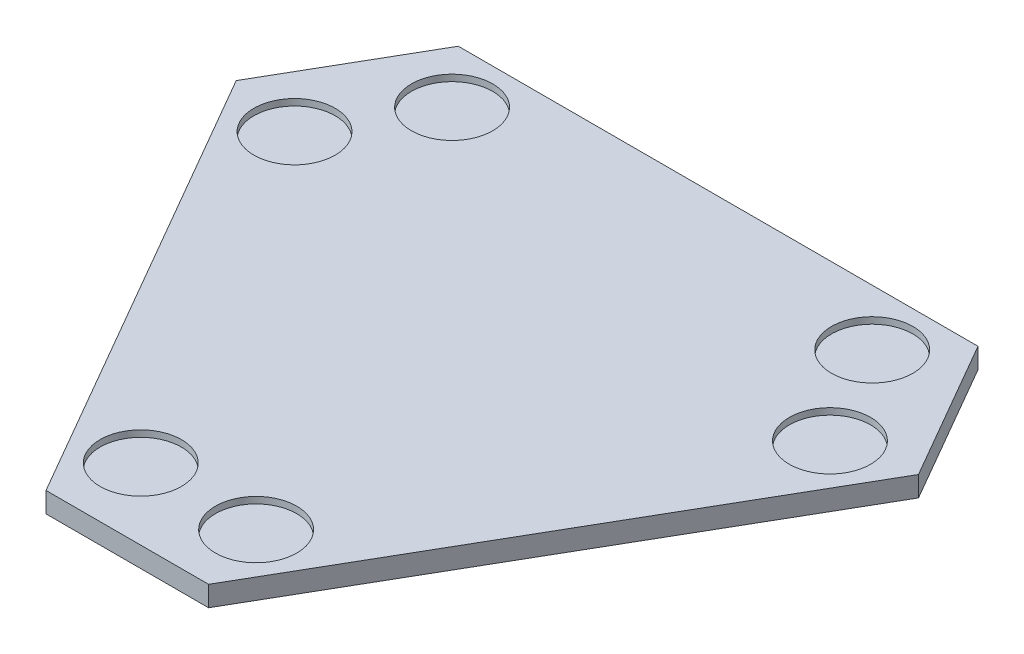
ISO-10303-21;
HEADER;
FILE_DESCRIPTION(('STEP AP214'),'2;1');
FILE_NAME('part.step','',(''),(''),'','','');
FILE_SCHEMA(('AUTOMOTIVE_DESIGN { 1 0 10303 214 1 1 1 1 }'));
ENDSEC;
DATA;
#1=APPLICATION_CONTEXT('core data for automotive mechanical design processes');
#2=APPLICATION_PROTOCOL_DEFINITION('international standard','automotive_design',2000,#1);
#3=PRODUCT_CONTEXT('',#1,'mechanical');
#4=PRODUCT('Part','Part','',(#3));
#5=PRODUCT_RELATED_PRODUCT_CATEGORY('part','',(#4));
#6=PRODUCT_DEFINITION_FORMATION('','',#4);
#7=PRODUCT_DEFINITION_CONTEXT('part definition',#1,'design');
#8=PRODUCT_DEFINITION('design','',#6,#7);
#9=PRODUCT_DEFINITION_SHAPE('','',#8);
#10=(LENGTH_UNIT() NAMED_UNIT(*) SI_UNIT(.MILLI.,.METRE.));
#11=(NAMED_UNIT(*) PLANE_ANGLE_UNIT() SI_UNIT($,.RADIAN.));
#12=(NAMED_UNIT(*) SI_UNIT($,.STERADIAN.) SOLID_ANGLE_UNIT());
#13=UNCERTAINTY_MEASURE_WITH_UNIT(LENGTH_MEASURE(1.E-05),#10,'distance_accuracy_value','');
#14=(GEOMETRIC_REPRESENTATION_CONTEXT(3) GLOBAL_UNCERTAINTY_ASSIGNED_CONTEXT((#13)) GLOBAL_UNIT_ASSIGNED_CONTEXT((#10,
#11,#12)) REPRESENTATION_CONTEXT('',''));
#15=CARTESIAN_POINT('',(0.,0.,0.));
#16=DIRECTION('',(0.,0.,1.));
#17=DIRECTION('',(1.,0.,0.));
#18=AXIS2_PLACEMENT_3D('',#15,#16,#17);
#19=CARTESIAN_POINT('',(51.9615242270663,5.,30.));
#20=DIRECTION('',(0.866025403784439,0.,0.5));
#21=DIRECTION('',(0.5,0.,-0.866025403784439));
#22=AXIS2_PLACEMENT_3D('',#19,#20,#21);
#23=PLANE('',#22);
#24=DIRECTION('',(-0.5,0.,0.866025403784439));
#25=VECTOR('',#24,1.);
#26=CARTESIAN_POINT('',(51.9615242270663,0.,30.));
#27=LINE('',#26,#25);
#28=CARTESIAN_POINT('',(83.9230484541325,0.,-25.3589838486223));
#29=VERTEX_POINT('',#28);
#30=CARTESIAN_POINT('',(20.,0.,85.3589838486224));
#31=VERTEX_POINT('',#30);
#32=EDGE_CURVE('E164',#29,#31,#27,.T.);
#33=ORIENTED_EDGE('',*,*,#32,.F.);
#34=DIRECTION('',(0.,-1.,0.));
#35=VECTOR('',#34,1.);
#36=CARTESIAN_POINT('',(83.9230484541325,5.,-25.3589838486223));
#37=LINE('',#36,#35);
#38=CARTESIAN_POINT('',(83.9230484541325,5.,-25.3589838486223));
#39=VERTEX_POINT('',#38);
#40=EDGE_CURVE('E89',#39,#29,#37,.T.);
#41=ORIENTED_EDGE('',*,*,#40,.F.);
#42=DIRECTION('',(-0.5,0.,0.866025403784439));
#43=VECTOR('',#42,1.);
#44=CARTESIAN_POINT('',(51.9615242270663,5.,30.));
#45=LINE('',#44,#43);
#46=CARTESIAN_POINT('',(20.,5.,85.3589838486224));
#47=VERTEX_POINT('',#46);
#48=EDGE_CURVE('E394',#39,#47,#45,.T.);
#49=ORIENTED_EDGE('',*,*,#48,.T.);
#50=DIRECTION('',(0.,-1.,0.));
#51=VECTOR('',#50,1.);
#52=CARTESIAN_POINT('',(20.,5.,85.3589838486224));
#53=LINE('',#52,#51);
#54=EDGE_CURVE('E12',#47,#31,#53,.T.);
#55=ORIENTED_EDGE('',*,*,#54,.T.);
#56=EDGE_LOOP('',(#33,#41,#49,#55));
#57=FACE_BOUND('',#56,.T.);
#58=ADVANCED_FACE('F80',(#57),#23,.T.);
#59=CARTESIAN_POINT('',(73.9230484541325,5.,-42.6794919243112));
#60=DIRECTION('',(0.866025403784439,0.,-0.5));
#61=DIRECTION('',(-0.5,0.,-0.866025403784439));
#62=AXIS2_PLACEMENT_3D('',#59,#60,#61);
#63=PLANE('',#62);
#64=DIRECTION('',(0.5,0.,0.866025403784439));
#65=VECTOR('',#64,1.);
#66=CARTESIAN_POINT('',(73.9230484541325,0.,-42.6794919243112));
#67=LINE('',#66,#65);
#68=CARTESIAN_POINT('',(63.9230484541325,0.,-60.));
#69=VERTEX_POINT('',#68);
#70=EDGE_CURVE('E168',#69,#29,#67,.T.);
#71=ORIENTED_EDGE('',*,*,#70,.F.);
#72=DIRECTION('',(0.,-1.,0.));
#73=VECTOR('',#72,1.);
#74=CARTESIAN_POINT('',(63.9230484541325,5.,-60.));
#75=LINE('',#74,#73);
#76=CARTESIAN_POINT('',(63.9230484541325,5.,-60.));
#77=VERTEX_POINT('',#76);
#78=EDGE_CURVE('E144',#77,#69,#75,.T.);
#79=ORIENTED_EDGE('',*,*,#78,.F.);
#80=DIRECTION('',(0.5,0.,0.866025403784439));
#81=VECTOR('',#80,1.);
#82=CARTESIAN_POINT('',(73.9230484541325,5.,-42.6794919243112));
#83=LINE('',#82,#81);
#84=EDGE_CURVE('E154',#77,#39,#83,.T.);
#85=ORIENTED_EDGE('',*,*,#84,.T.);
#86=ORIENTED_EDGE('',*,*,#40,.T.);
#87=EDGE_LOOP('',(#71,#79,#85,#86));
#88=FACE_BOUND('',#87,.T.);
#89=ADVANCED_FACE('F183',(#88),#63,.T.);
#90=CARTESIAN_POINT('',(0.,5.,-60.));
#91=DIRECTION('',(0.,0.,-1.));
#92=DIRECTION('',(-1.,0.,0.));
#93=AXIS2_PLACEMENT_3D('',#90,#91,#92);
#94=PLANE('',#93);
#95=DIRECTION('',(1.,0.,0.));
#96=VECTOR('',#95,1.);
#97=CARTESIAN_POINT('',(0.,0.,-60.));
#98=LINE('',#97,#96);
#99=CARTESIAN_POINT('',(-63.9230484541325,0.,-60.));
#100=VERTEX_POINT('',#99);
#101=EDGE_CURVE('E140',#100,#69,#98,.T.);
#102=ORIENTED_EDGE('',*,*,#101,.F.);
#103=DIRECTION('',(0.,-1.,0.));
#104=VECTOR('',#103,1.);
#105=CARTESIAN_POINT('',(-63.9230484541325,5.,-60.));
#106=LINE('',#105,#104);
#107=CARTESIAN_POINT('',(-63.9230484541325,5.,-60.));
#108=VERTEX_POINT('',#107);
#109=EDGE_CURVE('E135',#108,#100,#106,.T.);
#110=ORIENTED_EDGE('',*,*,#109,.F.);
#111=DIRECTION('',(1.,0.,0.));
#112=VECTOR('',#111,1.);
#113=CARTESIAN_POINT('',(0.,5.,-60.));
#114=LINE('',#113,#112);
#115=EDGE_CURVE('E138',#108,#77,#114,.T.);
#116=ORIENTED_EDGE('',*,*,#115,.T.);
#117=ORIENTED_EDGE('',*,*,#78,.T.);
#118=EDGE_LOOP('',(#102,#110,#116,#117));
#119=FACE_BOUND('',#118,.T.);
#120=ADVANCED_FACE('F137',(#119),#94,.T.);
#121=CARTESIAN_POINT('',(-73.9230484541325,5.,-42.6794919243112));
#122=DIRECTION('',(-0.866025403784439,0.,-0.5));
#123=DIRECTION('',(-0.5,0.,0.866025403784439));
#124=AXIS2_PLACEMENT_3D('',#121,#122,#123);
#125=PLANE('',#124);
#126=DIRECTION('',(0.5,0.,-0.866025403784439));
#127=VECTOR('',#126,1.);
#128=CARTESIAN_POINT('',(-73.9230484541325,0.,-42.6794919243112));
#129=LINE('',#128,#127);
#130=CARTESIAN_POINT('',(-83.9230484541326,0.,-25.3589838486223));
#131=VERTEX_POINT('',#130);
#132=EDGE_CURVE('E172',#131,#100,#129,.T.);
#133=ORIENTED_EDGE('',*,*,#132,.F.);
#134=DIRECTION('',(0.,-1.,0.));
#135=VECTOR('',#134,1.);
#136=CARTESIAN_POINT('',(-83.9230484541326,5.,-25.3589838486223));
#137=LINE('',#136,#135);
#138=CARTESIAN_POINT('',(-83.9230484541326,5.,-25.3589838486223));
#139=VERTEX_POINT('',#138);
#140=EDGE_CURVE('E116',#139,#131,#137,.T.);
#141=ORIENTED_EDGE('',*,*,#140,.F.);
#142=DIRECTION('',(0.5,0.,-0.866025403784439));
#143=VECTOR('',#142,1.);
#144=CARTESIAN_POINT('',(-73.9230484541325,5.,-42.6794919243112));
#145=LINE('',#144,#143);
#146=EDGE_CURVE('E151',#139,#108,#145,.T.);
#147=ORIENTED_EDGE('',*,*,#146,.T.);
#148=ORIENTED_EDGE('',*,*,#109,.T.);
#149=EDGE_LOOP('',(#133,#141,#147,#148));
#150=FACE_BOUND('',#149,.T.);
#151=ADVANCED_FACE('F156',(#150),#125,.T.);
#152=CARTESIAN_POINT('',(-51.9615242270663,5.,30.));
#153=DIRECTION('',(-0.866025403784439,0.,0.5));
#154=DIRECTION('',(0.5,0.,0.866025403784439));
#155=AXIS2_PLACEMENT_3D('',#152,#153,#154);
#156=PLANE('',#155);
#157=DIRECTION('',(-0.5,0.,-0.866025403784439));
#158=VECTOR('',#157,1.);
#159=CARTESIAN_POINT('',(-51.9615242270663,0.,30.));
#160=LINE('',#159,#158);
#161=CARTESIAN_POINT('',(-20.,0.,85.3589838486224));
#162=VERTEX_POINT('',#161);
#163=EDGE_CURVE('E174',#162,#131,#160,.T.);
#164=ORIENTED_EDGE('',*,*,#163,.F.);
#165=DIRECTION('',(0.,-1.,0.));
#166=VECTOR('',#165,1.);
#167=CARTESIAN_POINT('',(-20.,5.,85.3589838486224));
#168=LINE('',#167,#166);
#169=CARTESIAN_POINT('',(-20.,5.,85.3589838486224));
#170=VERTEX_POINT('',#169);
#171=EDGE_CURVE('E97',#170,#162,#168,.T.);
#172=ORIENTED_EDGE('',*,*,#171,.F.);
#173=DIRECTION('',(-0.5,0.,-0.866025403784439));
#174=VECTOR('',#173,1.);
#175=CARTESIAN_POINT('',(-51.9615242270663,5.,30.));
#176=LINE('',#175,#174);
#177=EDGE_CURVE('E157',#170,#139,#176,.T.);
#178=ORIENTED_EDGE('',*,*,#177,.T.);
#179=ORIENTED_EDGE('',*,*,#140,.T.);
#180=EDGE_LOOP('',(#164,#172,#178,#179));
#181=FACE_BOUND('',#180,.T.);
#182=ADVANCED_FACE('F188',(#181),#156,.T.);
#183=CARTESIAN_POINT('',(0.,5.,85.3589838486224));
#184=DIRECTION('',(0.,0.,1.));
#185=DIRECTION('',(1.,0.,0.));
#186=AXIS2_PLACEMENT_3D('',#183,#184,#185);
#187=PLANE('',#186);
#188=DIRECTION('',(-1.,0.,0.));
#189=VECTOR('',#188,1.);
#190=CARTESIAN_POINT('',(0.,0.,85.3589838486224));
#191=LINE('',#190,#189);
#192=EDGE_CURVE('E162',#31,#162,#191,.T.);
#193=ORIENTED_EDGE('',*,*,#192,.F.);
#194=ORIENTED_EDGE('',*,*,#54,.F.);
#195=DIRECTION('',(-1.,0.,0.));
#196=VECTOR('',#195,1.);
#197=CARTESIAN_POINT('',(0.,5.,85.3589838486224));
#198=LINE('',#197,#196);
#199=EDGE_CURVE('E177',#47,#170,#198,.T.);
#200=ORIENTED_EDGE('',*,*,#199,.T.);
#201=ORIENTED_EDGE('',*,*,#171,.T.);
#202=EDGE_LOOP('',(#193,#194,#200,#201));
#203=FACE_BOUND('',#202,.T.);
#204=ADVANCED_FACE('F82',(#203),#187,.T.);
#205=CARTESIAN_POINT('',(0.,0.,0.));
#206=DIRECTION('',(0.,1.,0.));
#207=DIRECTION('',(0.,0.,1.));
#208=AXIS2_PLACEMENT_3D('',#205,#206,#207);
#209=PLANE('',#208);
#210=ORIENTED_EDGE('',*,*,#192,.T.);
#211=ORIENTED_EDGE('',*,*,#163,.T.);
#212=ORIENTED_EDGE('',*,*,#132,.T.);
#213=ORIENTED_EDGE('',*,*,#101,.T.);
#214=ORIENTED_EDGE('',*,*,#70,.T.);
#215=ORIENTED_EDGE('',*,*,#32,.T.);
#216=EDGE_LOOP('',(#210,#211,#212,#213,#214,#215));
#217=FACE_BOUND('',#216,.T.);
#218=ADVANCED_FACE('F187',(#217),#209,.F.);
#219=CARTESIAN_POINT('',(0.,5.,0.));
#220=DIRECTION('',(0.,1.,0.));
#221=DIRECTION('',(0.,0.,1.));
#222=AXIS2_PLACEMENT_3D('',#219,#220,#221);
#223=PLANE('',#222);
#224=CARTESIAN_POINT('',(51.6741066212283,5.,-46.2157895935462));
#225=DIRECTION('',(0.,1.,0.));
#226=DIRECTION('',(0.,0.,1.));
#227=AXIS2_PLACEMENT_3D('',#224,#225,#226);
#228=CIRCLE('',#227,10.);
#229=CARTESIAN_POINT('',(51.6741066212283,5.,-36.2157895935462));
#230=VERTEX_POINT('',#229);
#231=EDGE_CURVE('E366',#230,#230,#228,.T.);
#232=ORIENTED_EDGE('',*,*,#231,.F.);
#233=EDGE_LOOP('',(#232));
#234=FACE_BOUND('',#233,.T.);
#235=CARTESIAN_POINT('',(65.8611011545821,5.,-21.6431942550751));
#236=DIRECTION('',(0.,1.,0.));
#237=DIRECTION('',(0.,0.,1.));
#238=AXIS2_PLACEMENT_3D('',#235,#236,#237);
#239=CIRCLE('',#238,10.);
#240=CARTESIAN_POINT('',(65.8611011545821,5.,-11.6431942550751));
#241=VERTEX_POINT('',#240);
#242=EDGE_CURVE('E365',#241,#241,#239,.T.);
#243=ORIENTED_EDGE('',*,*,#242,.F.);
#244=EDGE_LOOP('',(#243));
#245=FACE_BOUND('',#244,.T.);
#246=CARTESIAN_POINT('',(-65.8611011545818,5.,-21.643194255076));
#247=DIRECTION('',(0.,1.,0.));
#248=DIRECTION('',(0.,0.,1.));
#249=AXIS2_PLACEMENT_3D('',#246,#247,#248);
#250=CIRCLE('',#249,10.);
#251=CARTESIAN_POINT('',(-65.8611011545818,5.,-11.643194255076));
#252=VERTEX_POINT('',#251);
#253=EDGE_CURVE('E406',#252,#252,#250,.T.);
#254=ORIENTED_EDGE('',*,*,#253,.F.);
#255=EDGE_LOOP('',(#254));
#256=FACE_BOUND('',#255,.T.);
#257=CARTESIAN_POINT('',(-51.6741066212277,5.,-46.2157895935469));
#258=DIRECTION('',(0.,1.,0.));
#259=DIRECTION('',(0.,0.,1.));
#260=AXIS2_PLACEMENT_3D('',#257,#258,#259);
#261=CIRCLE('',#260,10.);
#262=CARTESIAN_POINT('',(-51.6741066212277,5.,-36.2157895935469));
#263=VERTEX_POINT('',#262);
#264=EDGE_CURVE('E379',#263,#263,#261,.T.);
#265=ORIENTED_EDGE('',*,*,#264,.F.);
#266=EDGE_LOOP('',(#265));
#267=FACE_BOUND('',#266,.T.);
#268=CARTESIAN_POINT('',(-14.1869945333539,5.,67.8589838486224));
#269=DIRECTION('',(0.,1.,0.));
#270=DIRECTION('',(0.,0.,1.));
#271=AXIS2_PLACEMENT_3D('',#268,#269,#270);
#272=CIRCLE('',#271,10.);
#273=CARTESIAN_POINT('',(-14.1869945333539,5.,77.8589838486224));
#274=VERTEX_POINT('',#273);
#275=EDGE_CURVE('E385',#274,#274,#272,.T.);
#276=ORIENTED_EDGE('',*,*,#275,.F.);
#277=EDGE_LOOP('',(#276));
#278=FACE_BOUND('',#277,.T.);
#279=CARTESIAN_POINT('',(14.186994533354,5.,67.8589838486224));
#280=DIRECTION('',(0.,1.,0.));
#281=DIRECTION('',(0.,0.,1.));
#282=AXIS2_PLACEMENT_3D('',#279,#280,#281);
#283=CIRCLE('',#282,10.);
#284=CARTESIAN_POINT('',(14.186994533354,5.,77.8589838486224));
#285=VERTEX_POINT('',#284);
#286=EDGE_CURVE('E388',#285,#285,#283,.T.);
#287=ORIENTED_EDGE('',*,*,#286,.F.);
#288=EDGE_LOOP('',(#287));
#289=FACE_BOUND('',#288,.T.);
#290=ORIENTED_EDGE('',*,*,#199,.F.);
#291=ORIENTED_EDGE('',*,*,#48,.F.);
#292=ORIENTED_EDGE('',*,*,#84,.F.);
#293=ORIENTED_EDGE('',*,*,#115,.F.);
#294=ORIENTED_EDGE('',*,*,#146,.F.);
#295=ORIENTED_EDGE('',*,*,#177,.F.);
#296=EDGE_LOOP('',(#290,#291,#292,#293,#294,#295));
#297=FACE_BOUND('',#296,.T.);
#298=ADVANCED_FACE('F149',(#234,#245,#256,#267,#278,#289,#297),#223,.T.);
#299=CARTESIAN_POINT('',(14.186994533354,3.4,67.8589838486224));
#300=DIRECTION('',(0.,1.,0.));
#301=DIRECTION('',(0.,0.,1.));
#302=AXIS2_PLACEMENT_3D('',#299,#300,#301);
#303=CYLINDRICAL_SURFACE('',#302,10.);
#304=CARTESIAN_POINT('',(14.186994533354,3.4,67.8589838486224));
#305=DIRECTION('',(0.,1.,0.));
#306=DIRECTION('',(0.,0.,1.));
#307=AXIS2_PLACEMENT_3D('',#304,#305,#306);
#308=CIRCLE('',#307,10.);
#309=CARTESIAN_POINT('',(14.186994533354,3.4,77.8589838486224));
#310=VERTEX_POINT('',#309);
#311=EDGE_CURVE('E378',#310,#310,#308,.T.);
#312=ORIENTED_EDGE('',*,*,#311,.F.);
#313=EDGE_LOOP('',(#312));
#314=FACE_BOUND('',#313,.T.);
#315=ORIENTED_EDGE('',*,*,#286,.T.);
#316=EDGE_LOOP('',(#315));
#317=FACE_BOUND('',#316,.T.);
#318=ADVANCED_FACE('F236',(#314,#317),#303,.F.);
#319=CARTESIAN_POINT('',(14.186994533354,3.4,67.8589838486224));
#320=DIRECTION('',(0.,1.,0.));
#321=DIRECTION('',(0.,0.,1.));
#322=AXIS2_PLACEMENT_3D('',#319,#320,#321);
#323=PLANE('',#322);
#324=ORIENTED_EDGE('',*,*,#311,.T.);
#325=EDGE_LOOP('',(#324));
#326=FACE_BOUND('',#325,.T.);
#327=ADVANCED_FACE('F241',(#326),#323,.T.);
#328=CARTESIAN_POINT('',(-14.1869945333539,3.4,67.8589838486224));
#329=DIRECTION('',(0.,1.,0.));
#330=DIRECTION('',(0.,0.,1.));
#331=AXIS2_PLACEMENT_3D('',#328,#329,#330);
#332=CYLINDRICAL_SURFACE('',#331,10.);
#333=CARTESIAN_POINT('',(-14.1869945333539,3.4,67.8589838486224));
#334=DIRECTION('',(0.,1.,0.));
#335=DIRECTION('',(0.,0.,1.));
#336=AXIS2_PLACEMENT_3D('',#333,#334,#335);
#337=CIRCLE('',#336,10.);
#338=CARTESIAN_POINT('',(-14.1869945333539,3.4,77.8589838486224));
#339=VERTEX_POINT('',#338);
#340=EDGE_CURVE('E165',#339,#339,#337,.T.);
#341=ORIENTED_EDGE('',*,*,#340,.F.);
#342=EDGE_LOOP('',(#341));
#343=FACE_BOUND('',#342,.T.);
#344=ORIENTED_EDGE('',*,*,#275,.T.);
#345=EDGE_LOOP('',(#344));
#346=FACE_BOUND('',#345,.T.);
#347=ADVANCED_FACE('F251',(#343,#346),#332,.F.);
#348=CARTESIAN_POINT('',(-14.1869945333539,3.4,67.8589838486224));
#349=DIRECTION('',(0.,1.,0.));
#350=DIRECTION('',(0.,0.,1.));
#351=AXIS2_PLACEMENT_3D('',#348,#349,#350);
#352=PLANE('',#351);
#353=ORIENTED_EDGE('',*,*,#340,.T.);
#354=EDGE_LOOP('',(#353));
#355=FACE_BOUND('',#354,.T.);
#356=ADVANCED_FACE('F261',(#355),#352,.T.);
#357=CARTESIAN_POINT('',(-51.6741066212277,3.4,-46.2157895935469));
#358=DIRECTION('',(0.,1.,0.));
#359=DIRECTION('',(0.,0.,1.));
#360=AXIS2_PLACEMENT_3D('',#357,#358,#359);
#361=CYLINDRICAL_SURFACE('',#360,10.);
#362=CARTESIAN_POINT('',(-51.6741066212277,3.4,-46.2157895935469));
#363=DIRECTION('',(0.,1.,0.));
#364=DIRECTION('',(0.,0.,1.));
#365=AXIS2_PLACEMENT_3D('',#362,#363,#364);
#366=CIRCLE('',#365,10.);
#367=CARTESIAN_POINT('',(-51.6741066212277,3.4,-36.2157895935469));
#368=VERTEX_POINT('',#367);
#369=EDGE_CURVE('E375',#368,#368,#366,.T.);
#370=ORIENTED_EDGE('',*,*,#369,.F.);
#371=EDGE_LOOP('',(#370));
#372=FACE_BOUND('',#371,.T.);
#373=ORIENTED_EDGE('',*,*,#264,.T.);
#374=EDGE_LOOP('',(#373));
#375=FACE_BOUND('',#374,.T.);
#376=ADVANCED_FACE('F271',(#372,#375),#361,.F.);
#377=CARTESIAN_POINT('',(-51.6741066212277,3.4,-46.2157895935469));
#378=DIRECTION('',(0.,1.,0.));
#379=DIRECTION('',(0.,0.,1.));
#380=AXIS2_PLACEMENT_3D('',#377,#378,#379);
#381=PLANE('',#380);
#382=ORIENTED_EDGE('',*,*,#369,.T.);
#383=EDGE_LOOP('',(#382));
#384=FACE_BOUND('',#383,.T.);
#385=ADVANCED_FACE('F288',(#384),#381,.T.);
#386=CARTESIAN_POINT('',(-65.8611011545818,3.4,-21.643194255076));
#387=DIRECTION('',(0.,1.,0.));
#388=DIRECTION('',(0.,0.,1.));
#389=AXIS2_PLACEMENT_3D('',#386,#387,#388);
#390=CYLINDRICAL_SURFACE('',#389,10.);
#391=CARTESIAN_POINT('',(-65.8611011545818,3.4,-21.643194255076));
#392=DIRECTION('',(0.,1.,0.));
#393=DIRECTION('',(0.,0.,1.));
#394=AXIS2_PLACEMENT_3D('',#391,#392,#393);
#395=CIRCLE('',#394,10.);
#396=CARTESIAN_POINT('',(-65.8611011545818,3.4,-11.643194255076));
#397=VERTEX_POINT('',#396);
#398=EDGE_CURVE('E382',#397,#397,#395,.T.);
#399=ORIENTED_EDGE('',*,*,#398,.F.);
#400=EDGE_LOOP('',(#399));
#401=FACE_BOUND('',#400,.T.);
#402=ORIENTED_EDGE('',*,*,#253,.T.);
#403=EDGE_LOOP('',(#402));
#404=FACE_BOUND('',#403,.T.);
#405=ADVANCED_FACE('F298',(#401,#404),#390,.F.);
#406=CARTESIAN_POINT('',(-65.8611011545818,3.4,-21.643194255076));
#407=DIRECTION('',(0.,1.,0.));
#408=DIRECTION('',(0.,0.,1.));
#409=AXIS2_PLACEMENT_3D('',#406,#407,#408);
#410=PLANE('',#409);
#411=ORIENTED_EDGE('',*,*,#398,.T.);
#412=EDGE_LOOP('',(#411));
#413=FACE_BOUND('',#412,.T.);
#414=ADVANCED_FACE('F308',(#413),#410,.T.);
#415=CARTESIAN_POINT('',(65.8611011545821,3.4,-21.6431942550751));
#416=DIRECTION('',(0.,1.,0.));
#417=DIRECTION('',(0.,0.,1.));
#418=AXIS2_PLACEMENT_3D('',#415,#416,#417);
#419=CYLINDRICAL_SURFACE('',#418,10.);
#420=CARTESIAN_POINT('',(65.8611011545821,3.4,-21.6431942550751));
#421=DIRECTION('',(0.,1.,0.));
#422=DIRECTION('',(0.,0.,1.));
#423=AXIS2_PLACEMENT_3D('',#420,#421,#422);
#424=CIRCLE('',#423,10.);
#425=CARTESIAN_POINT('',(65.8611011545821,3.4,-11.6431942550751));
#426=VERTEX_POINT('',#425);
#427=EDGE_CURVE('E369',#426,#426,#424,.T.);
#428=ORIENTED_EDGE('',*,*,#427,.F.);
#429=EDGE_LOOP('',(#428));
#430=FACE_BOUND('',#429,.T.);
#431=ORIENTED_EDGE('',*,*,#242,.T.);
#432=EDGE_LOOP('',(#431));
#433=FACE_BOUND('',#432,.T.);
#434=ADVANCED_FACE('F318',(#430,#433),#419,.F.);
#435=CARTESIAN_POINT('',(65.8611011545821,3.4,-21.6431942550751));
#436=DIRECTION('',(0.,1.,0.));
#437=DIRECTION('',(0.,0.,1.));
#438=AXIS2_PLACEMENT_3D('',#435,#436,#437);
#439=PLANE('',#438);
#440=ORIENTED_EDGE('',*,*,#427,.T.);
#441=EDGE_LOOP('',(#440));
#442=FACE_BOUND('',#441,.T.);
#443=ADVANCED_FACE('F328',(#442),#439,.T.);
#444=CARTESIAN_POINT('',(51.6741066212283,3.4,-46.2157895935462));
#445=DIRECTION('',(0.,1.,0.));
#446=DIRECTION('',(0.,0.,1.));
#447=AXIS2_PLACEMENT_3D('',#444,#445,#446);
#448=CYLINDRICAL_SURFACE('',#447,10.);
#449=CARTESIAN_POINT('',(51.6741066212283,3.4,-46.2157895935462));
#450=DIRECTION('',(0.,1.,0.));
#451=DIRECTION('',(0.,0.,1.));
#452=AXIS2_PLACEMENT_3D('',#449,#450,#451);
#453=CIRCLE('',#452,10.);
#454=CARTESIAN_POINT('',(51.6741066212283,3.4,-36.2157895935462));
#455=VERTEX_POINT('',#454);
#456=EDGE_CURVE('E364',#455,#455,#453,.T.);
#457=ORIENTED_EDGE('',*,*,#456,.F.);
#458=EDGE_LOOP('',(#457));
#459=FACE_BOUND('',#458,.T.);
#460=ORIENTED_EDGE('',*,*,#231,.T.);
#461=EDGE_LOOP('',(#460));
#462=FACE_BOUND('',#461,.T.);
#463=ADVANCED_FACE('F338',(#459,#462),#448,.F.);
#464=CARTESIAN_POINT('',(51.6741066212283,3.4,-46.2157895935462));
#465=DIRECTION('',(0.,1.,0.));
#466=DIRECTION('',(0.,0.,1.));
#467=AXIS2_PLACEMENT_3D('',#464,#465,#466);
#468=PLANE('',#467);
#469=ORIENTED_EDGE('',*,*,#456,.T.);
#470=EDGE_LOOP('',(#469));
#471=FACE_BOUND('',#470,.T.);
#472=ADVANCED_FACE('F348',(#471),#468,.T.);
#473=CLOSED_SHELL('',(#58,#89,#120,#151,#182,#204,#218,#298,#318,#327,#347,#356,#376,#385,#405,
#414,#434,#443,#463,#472));
#474=MANIFOLD_SOLID_BREP('B2',#473);
#475=ADVANCED_BREP_SHAPE_REPRESENTATION('',(#18,#474),#14);
#476=SHAPE_DEFINITION_REPRESENTATION(#9,#475);
ENDSEC;
END-ISO-10303-21;
